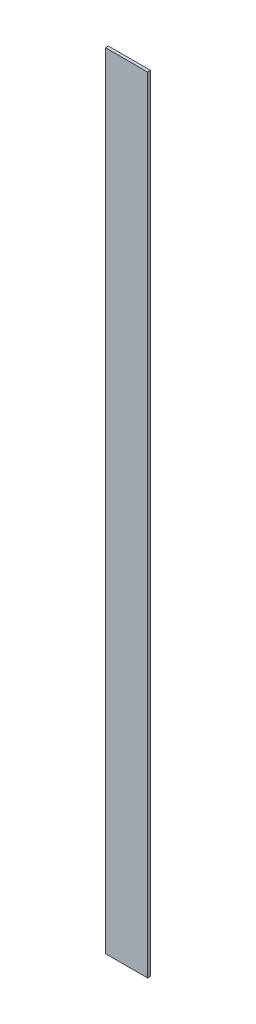
ISO-10303-21;
HEADER;
FILE_DESCRIPTION(('STEP AP214'),'2;1');
FILE_NAME('part.step','',(''),(''),'','','');
FILE_SCHEMA(('AUTOMOTIVE_DESIGN { 1 0 10303 214 1 1 1 1 }'));
ENDSEC;
DATA;
#1=APPLICATION_CONTEXT('core data for automotive mechanical design processes');
#2=APPLICATION_PROTOCOL_DEFINITION('international standard','automotive_design',2000,#1);
#3=PRODUCT_CONTEXT('',#1,'mechanical');
#4=PRODUCT('Part','Part','',(#3));
#5=PRODUCT_RELATED_PRODUCT_CATEGORY('part','',(#4));
#6=PRODUCT_DEFINITION_FORMATION('','',#4);
#7=PRODUCT_DEFINITION_CONTEXT('part definition',#1,'design');
#8=PRODUCT_DEFINITION('design','',#6,#7);
#9=PRODUCT_DEFINITION_SHAPE('','',#8);
#10=(LENGTH_UNIT() NAMED_UNIT(*) SI_UNIT(.MILLI.,.METRE.));
#11=(NAMED_UNIT(*) PLANE_ANGLE_UNIT() SI_UNIT($,.RADIAN.));
#12=(NAMED_UNIT(*) SI_UNIT($,.STERADIAN.) SOLID_ANGLE_UNIT());
#13=UNCERTAINTY_MEASURE_WITH_UNIT(LENGTH_MEASURE(1.E-05),#10,'distance_accuracy_value','');
#14=(GEOMETRIC_REPRESENTATION_CONTEXT(3) GLOBAL_UNCERTAINTY_ASSIGNED_CONTEXT((#13)) GLOBAL_UNIT_ASSIGNED_CONTEXT((#10,
#11,#12)) REPRESENTATION_CONTEXT('',''));
#15=CARTESIAN_POINT('',(0.,0.,0.));
#16=DIRECTION('',(0.,0.,1.));
#17=DIRECTION('',(1.,0.,0.));
#18=AXIS2_PLACEMENT_3D('',#15,#16,#17);
#19=CARTESIAN_POINT('',(0.213515012925,0.,0.01));
#20=DIRECTION('',(0.,0.,1.));
#21=DIRECTION('',(1.,0.,0.));
#22=AXIS2_PLACEMENT_3D('',#19,#20,#21);
#23=PLANE('',#22);
#24=DIRECTION('',(-1.,0.,0.));
#25=VECTOR('',#24,1.);
#26=CARTESIAN_POINT('',(0.235,0.4,0.01));
#27=LINE('',#26,#25);
#28=CARTESIAN_POINT('',(0.235,0.4,0.01));
#29=VERTEX_POINT('',#28);
#30=CARTESIAN_POINT('',(0.192030025851,0.4,0.01));
#31=VERTEX_POINT('',#30);
#32=EDGE_CURVE('E20',#29,#31,#27,.T.);
#33=ORIENTED_EDGE('',*,*,#32,.F.);
#34=DIRECTION('',(0.,1.,0.));
#35=VECTOR('',#34,1.);
#36=CARTESIAN_POINT('',(0.235,-0.4,0.01));
#37=LINE('',#36,#35);
#38=CARTESIAN_POINT('',(0.235,-0.4,0.01));
#39=VERTEX_POINT('',#38);
#40=EDGE_CURVE('E89',#39,#29,#37,.T.);
#41=ORIENTED_EDGE('',*,*,#40,.F.);
#42=DIRECTION('',(1.,0.,0.));
#43=VECTOR('',#42,1.);
#44=CARTESIAN_POINT('',(-0.015,-0.4,0.01));
#45=LINE('',#44,#43);
#46=CARTESIAN_POINT('',(0.192030025851,-0.4,0.01));
#47=VERTEX_POINT('',#46);
#48=EDGE_CURVE('E71',#47,#39,#45,.T.);
#49=ORIENTED_EDGE('',*,*,#48,.F.);
#50=DIRECTION('',(0.,-1.,0.));
#51=VECTOR('',#50,1.);
#52=CARTESIAN_POINT('',(0.192030025851,0.4,0.01));
#53=LINE('',#52,#51);
#54=EDGE_CURVE('E102',#31,#47,#53,.T.);
#55=ORIENTED_EDGE('',*,*,#54,.F.);
#56=EDGE_LOOP('',(#33,#41,#49,#55));
#57=FACE_BOUND('',#56,.T.);
#58=ADVANCED_FACE('F17',(#57),#23,.F.);
#59=CARTESIAN_POINT('',(0.213515012925,0.,0.013));
#60=DIRECTION('',(0.,0.,1.));
#61=DIRECTION('',(1.,0.,0.));
#62=AXIS2_PLACEMENT_3D('',#59,#60,#61);
#63=PLANE('',#62);
#64=DIRECTION('',(-1.,0.,0.));
#65=VECTOR('',#64,1.);
#66=CARTESIAN_POINT('',(0.235,0.4,0.013));
#67=LINE('',#66,#65);
#68=CARTESIAN_POINT('',(0.235,0.4,0.013));
#69=VERTEX_POINT('',#68);
#70=CARTESIAN_POINT('',(0.192030025851,0.4,0.013));
#71=VERTEX_POINT('',#70);
#72=EDGE_CURVE('E11',#69,#71,#67,.T.);
#73=ORIENTED_EDGE('',*,*,#72,.T.);
#74=DIRECTION('',(0.,-1.,0.));
#75=VECTOR('',#74,1.);
#76=CARTESIAN_POINT('',(0.192030025851,0.4,0.013));
#77=LINE('',#76,#75);
#78=CARTESIAN_POINT('',(0.192030025851,-0.4,0.013));
#79=VERTEX_POINT('',#78);
#80=EDGE_CURVE('E112',#71,#79,#77,.T.);
#81=ORIENTED_EDGE('',*,*,#80,.T.);
#82=DIRECTION('',(1.,0.,0.));
#83=VECTOR('',#82,1.);
#84=CARTESIAN_POINT('',(-0.015,-0.4,0.013));
#85=LINE('',#84,#83);
#86=CARTESIAN_POINT('',(0.235,-0.4,0.013));
#87=VERTEX_POINT('',#86);
#88=EDGE_CURVE('E83',#79,#87,#85,.T.);
#89=ORIENTED_EDGE('',*,*,#88,.T.);
#90=DIRECTION('',(0.,1.,0.));
#91=VECTOR('',#90,1.);
#92=CARTESIAN_POINT('',(0.235,-0.4,0.013));
#93=LINE('',#92,#91);
#94=EDGE_CURVE('E90',#87,#69,#93,.T.);
#95=ORIENTED_EDGE('',*,*,#94,.T.);
#96=EDGE_LOOP('',(#73,#81,#89,#95));
#97=FACE_BOUND('',#96,.T.);
#98=ADVANCED_FACE('F123',(#97),#63,.T.);
#99=CARTESIAN_POINT('',(0.235,0.4,0.01));
#100=DIRECTION('',(0.,1.,0.));
#101=DIRECTION('',(1.,0.,0.));
#102=AXIS2_PLACEMENT_3D('',#99,#100,#101);
#103=PLANE('',#102);
#104=ORIENTED_EDGE('',*,*,#32,.T.);
#105=DIRECTION('',(0.,0.,1.));
#106=VECTOR('',#105,1.);
#107=CARTESIAN_POINT('',(0.192030025851,0.4,0.01));
#108=LINE('',#107,#106);
#109=EDGE_CURVE('E110',#31,#71,#108,.T.);
#110=ORIENTED_EDGE('',*,*,#109,.T.);
#111=ORIENTED_EDGE('',*,*,#72,.F.);
#112=DIRECTION('',(0.,0.,1.));
#113=VECTOR('',#112,1.);
#114=CARTESIAN_POINT('',(0.235,0.4,0.01));
#115=LINE('',#114,#113);
#116=EDGE_CURVE('E94',#29,#69,#115,.T.);
#117=ORIENTED_EDGE('',*,*,#116,.F.);
#118=EDGE_LOOP('',(#104,#110,#111,#117));
#119=FACE_BOUND('',#118,.T.);
#120=ADVANCED_FACE('F122',(#119),#103,.T.);
#121=CARTESIAN_POINT('',(0.192030025851,0.4,0.01));
#122=DIRECTION('',(-1.,0.,0.));
#123=DIRECTION('',(0.,0.,1.));
#124=AXIS2_PLACEMENT_3D('',#121,#122,#123);
#125=PLANE('',#124);
#126=ORIENTED_EDGE('',*,*,#54,.T.);
#127=DIRECTION('',(0.,0.,1.));
#128=VECTOR('',#127,1.);
#129=CARTESIAN_POINT('',(0.192030025851,-0.4,0.01));
#130=LINE('',#129,#128);
#131=EDGE_CURVE('E78',#47,#79,#130,.T.);
#132=ORIENTED_EDGE('',*,*,#131,.T.);
#133=ORIENTED_EDGE('',*,*,#80,.F.);
#134=ORIENTED_EDGE('',*,*,#109,.F.);
#135=EDGE_LOOP('',(#126,#132,#133,#134));
#136=FACE_BOUND('',#135,.T.);
#137=ADVANCED_FACE('F121',(#136),#125,.T.);
#138=CARTESIAN_POINT('',(0.192030025851,-0.4,0.01));
#139=DIRECTION('',(0.,-1.,0.));
#140=DIRECTION('',(0.,0.,-1.));
#141=AXIS2_PLACEMENT_3D('',#138,#139,#140);
#142=PLANE('',#141);
#143=ORIENTED_EDGE('',*,*,#48,.T.);
#144=DIRECTION('',(0.,0.,1.));
#145=VECTOR('',#144,1.);
#146=CARTESIAN_POINT('',(0.235,-0.4,0.01));
#147=LINE('',#146,#145);
#148=EDGE_CURVE('E75',#39,#87,#147,.T.);
#149=ORIENTED_EDGE('',*,*,#148,.T.);
#150=ORIENTED_EDGE('',*,*,#88,.F.);
#151=ORIENTED_EDGE('',*,*,#131,.F.);
#152=EDGE_LOOP('',(#143,#149,#150,#151));
#153=FACE_BOUND('',#152,.T.);
#154=ADVANCED_FACE('F73',(#153),#142,.T.);
#155=CARTESIAN_POINT('',(0.235,-0.4,0.01));
#156=DIRECTION('',(1.,0.,0.));
#157=DIRECTION('',(0.,1.,0.));
#158=AXIS2_PLACEMENT_3D('',#155,#156,#157);
#159=PLANE('',#158);
#160=ORIENTED_EDGE('',*,*,#40,.T.);
#161=ORIENTED_EDGE('',*,*,#116,.T.);
#162=ORIENTED_EDGE('',*,*,#94,.F.);
#163=ORIENTED_EDGE('',*,*,#148,.F.);
#164=EDGE_LOOP('',(#160,#161,#162,#163));
#165=FACE_BOUND('',#164,.T.);
#166=ADVANCED_FACE('F87',(#165),#159,.T.);
#167=CLOSED_SHELL('',(#58,#98,#120,#137,#154,#166));
#168=MANIFOLD_SOLID_BREP('B1',#167);
#169=ADVANCED_BREP_SHAPE_REPRESENTATION('',(#18,#168),#14);
#170=SHAPE_DEFINITION_REPRESENTATION(#9,#169);
ENDSEC;
END-ISO-10303-21;
